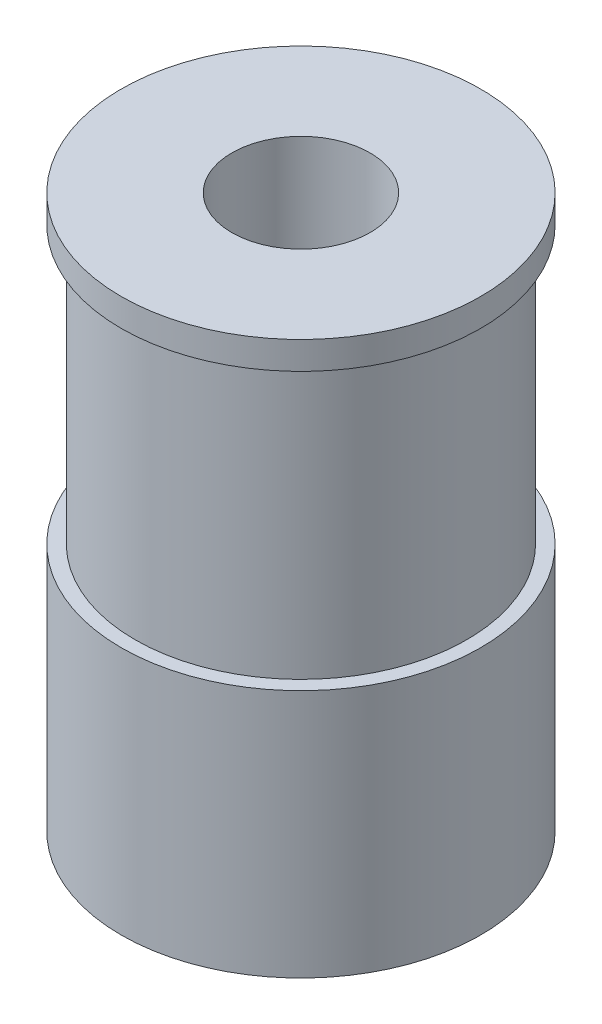
ISO-10303-21;
HEADER;
FILE_DESCRIPTION(('STEP AP214'),'2;1');
FILE_NAME('part.step','',(''),(''),'','','');
FILE_SCHEMA(('AUTOMOTIVE_DESIGN { 1 0 10303 214 1 1 1 1 }'));
ENDSEC;
DATA;
#1=APPLICATION_CONTEXT('core data for automotive mechanical design processes');
#2=APPLICATION_PROTOCOL_DEFINITION('international standard','automotive_design',2000,#1);
#3=PRODUCT_CONTEXT('',#1,'mechanical');
#4=PRODUCT('Part','Part','',(#3));
#5=PRODUCT_RELATED_PRODUCT_CATEGORY('part','',(#4));
#6=PRODUCT_DEFINITION_FORMATION('','',#4);
#7=PRODUCT_DEFINITION_CONTEXT('part definition',#1,'design');
#8=PRODUCT_DEFINITION('design','',#6,#7);
#9=PRODUCT_DEFINITION_SHAPE('','',#8);
#10=(LENGTH_UNIT() NAMED_UNIT(*) SI_UNIT(.MILLI.,.METRE.));
#11=(NAMED_UNIT(*) PLANE_ANGLE_UNIT() SI_UNIT($,.RADIAN.));
#12=(NAMED_UNIT(*) SI_UNIT($,.STERADIAN.) SOLID_ANGLE_UNIT());
#13=UNCERTAINTY_MEASURE_WITH_UNIT(LENGTH_MEASURE(1.E-05),#10,'distance_accuracy_value','');
#14=(GEOMETRIC_REPRESENTATION_CONTEXT(3) GLOBAL_UNCERTAINTY_ASSIGNED_CONTEXT((#13)) GLOBAL_UNIT_ASSIGNED_CONTEXT((#10,
#11,#12)) REPRESENTATION_CONTEXT('',''));
#15=CARTESIAN_POINT('',(0.,0.,0.));
#16=DIRECTION('',(0.,0.,1.));
#17=DIRECTION('',(1.,0.,0.));
#18=AXIS2_PLACEMENT_3D('',#15,#16,#17);
#19=CARTESIAN_POINT('',(0.,20.,0.));
#20=DIRECTION('',(0.,-1.,0.));
#21=DIRECTION('',(0.,0.,-1.));
#22=AXIS2_PLACEMENT_3D('',#19,#20,#21);
#23=CYLINDRICAL_SURFACE('',#22,6.5);
#24=CARTESIAN_POINT('',(0.,0.,0.));
#25=DIRECTION('',(0.,1.,0.));
#26=DIRECTION('',(0.,0.,1.));
#27=AXIS2_PLACEMENT_3D('',#24,#25,#26);
#28=CIRCLE('',#27,6.5);
#29=CARTESIAN_POINT('',(0.,0.,6.5));
#30=VERTEX_POINT('',#29);
#31=EDGE_CURVE('E41',#30,#30,#28,.T.);
#32=ORIENTED_EDGE('',*,*,#31,.T.);
#33=EDGE_LOOP('',(#32));
#34=FACE_BOUND('',#33,.T.);
#35=CARTESIAN_POINT('',(0.,9.,0.));
#36=DIRECTION('',(0.,1.,0.));
#37=DIRECTION('',(0.,0.,1.));
#38=AXIS2_PLACEMENT_3D('',#35,#36,#37);
#39=CIRCLE('',#38,6.5);
#40=CARTESIAN_POINT('',(0.,9.,6.5));
#41=VERTEX_POINT('',#40);
#42=EDGE_CURVE('E37',#41,#41,#39,.T.);
#43=ORIENTED_EDGE('',*,*,#42,.F.);
#44=EDGE_LOOP('',(#43));
#45=FACE_BOUND('',#44,.T.);
#46=ADVANCED_FACE('F33',(#34,#45),#23,.T.);
#47=CARTESIAN_POINT('',(0.,20.,0.));
#48=DIRECTION('',(0.,1.,0.));
#49=DIRECTION('',(0.,0.,1.));
#50=AXIS2_PLACEMENT_3D('',#47,#48,#49);
#51=PLANE('',#50);
#52=CARTESIAN_POINT('',(0.,20.,0.));
#53=DIRECTION('',(0.,1.,0.));
#54=DIRECTION('',(0.,0.,1.));
#55=AXIS2_PLACEMENT_3D('',#52,#53,#54);
#56=CIRCLE('',#55,6.5);
#57=CARTESIAN_POINT('',(0.,20.,6.5));
#58=VERTEX_POINT('',#57);
#59=EDGE_CURVE('E10',#58,#58,#56,.T.);
#60=ORIENTED_EDGE('',*,*,#59,.T.);
#61=EDGE_LOOP('',(#60));
#62=FACE_BOUND('',#61,.T.);
#63=CARTESIAN_POINT('',(0.,20.,0.));
#64=DIRECTION('',(0.,1.,0.));
#65=DIRECTION('',(0.,0.,1.));
#66=AXIS2_PLACEMENT_3D('',#63,#64,#65);
#67=CIRCLE('',#66,2.5);
#68=CARTESIAN_POINT('',(0.,20.,2.5));
#69=VERTEX_POINT('',#68);
#70=EDGE_CURVE('E46',#69,#69,#67,.T.);
#71=ORIENTED_EDGE('',*,*,#70,.F.);
#72=EDGE_LOOP('',(#71));
#73=FACE_BOUND('',#72,.T.);
#74=ADVANCED_FACE('F86',(#62,#73),#51,.T.);
#75=CARTESIAN_POINT('',(0.,0.,0.));
#76=DIRECTION('',(0.,1.,0.));
#77=DIRECTION('',(0.,0.,1.));
#78=AXIS2_PLACEMENT_3D('',#75,#76,#77);
#79=PLANE('',#78);
#80=ORIENTED_EDGE('',*,*,#31,.F.);
#81=EDGE_LOOP('',(#80));
#82=FACE_BOUND('',#81,.T.);
#83=CARTESIAN_POINT('',(0.,0.,0.));
#84=DIRECTION('',(0.,1.,0.));
#85=DIRECTION('',(0.,0.,1.));
#86=AXIS2_PLACEMENT_3D('',#83,#84,#85);
#87=CIRCLE('',#86,2.5);
#88=CARTESIAN_POINT('',(0.,0.,2.5));
#89=VERTEX_POINT('',#88);
#90=EDGE_CURVE('E49',#89,#89,#87,.T.);
#91=ORIENTED_EDGE('',*,*,#90,.T.);
#92=EDGE_LOOP('',(#91));
#93=FACE_BOUND('',#92,.T.);
#94=ADVANCED_FACE('F70',(#82,#93),#79,.F.);
#95=CARTESIAN_POINT('',(0.,19.,0.));
#96=DIRECTION('',(0.,1.,0.));
#97=DIRECTION('',(0.,0.,1.));
#98=AXIS2_PLACEMENT_3D('',#95,#96,#97);
#99=CIRCLE('',#98,6.5);
#100=CARTESIAN_POINT('',(0.,19.,6.5));
#101=VERTEX_POINT('',#100);
#102=EDGE_CURVE('E51',#101,#101,#99,.T.);
#103=ORIENTED_EDGE('',*,*,#102,.T.);
#104=EDGE_LOOP('',(#103));
#105=FACE_BOUND('',#104,.T.);
#106=ORIENTED_EDGE('',*,*,#59,.F.);
#107=EDGE_LOOP('',(#106));
#108=FACE_BOUND('',#107,.T.);
#109=ADVANCED_FACE('F35',(#105,#108),#23,.T.);
#110=CARTESIAN_POINT('',(0.,20.,0.));
#111=DIRECTION('',(0.,-1.,0.));
#112=DIRECTION('',(0.,0.,-1.));
#113=AXIS2_PLACEMENT_3D('',#110,#111,#112);
#114=CYLINDRICAL_SURFACE('',#113,2.5);
#115=ORIENTED_EDGE('',*,*,#70,.T.);
#116=EDGE_LOOP('',(#115));
#117=FACE_BOUND('',#116,.T.);
#118=ORIENTED_EDGE('',*,*,#90,.F.);
#119=EDGE_LOOP('',(#118));
#120=FACE_BOUND('',#119,.T.);
#121=ADVANCED_FACE('F72',(#117,#120),#114,.F.);
#122=CARTESIAN_POINT('',(0.,9.,0.));
#123=DIRECTION('',(0.,1.,0.));
#124=DIRECTION('',(0.,0.,1.));
#125=AXIS2_PLACEMENT_3D('',#122,#123,#124);
#126=PLANE('',#125);
#127=CARTESIAN_POINT('',(0.,9.,0.));
#128=DIRECTION('',(0.,1.,0.));
#129=DIRECTION('',(0.,0.,1.));
#130=AXIS2_PLACEMENT_3D('',#127,#128,#129);
#131=CIRCLE('',#130,6.);
#132=CARTESIAN_POINT('',(0.,9.,6.));
#133=VERTEX_POINT('',#132);
#134=EDGE_CURVE('E53',#133,#133,#131,.T.);
#135=ORIENTED_EDGE('',*,*,#134,.F.);
#136=EDGE_LOOP('',(#135));
#137=FACE_BOUND('',#136,.T.);
#138=ORIENTED_EDGE('',*,*,#42,.T.);
#139=EDGE_LOOP('',(#138));
#140=FACE_BOUND('',#139,.T.);
#141=ADVANCED_FACE('F74',(#137,#140),#126,.T.);
#142=CARTESIAN_POINT('',(0.,19.,0.));
#143=DIRECTION('',(0.,1.,0.));
#144=DIRECTION('',(0.,0.,1.));
#145=AXIS2_PLACEMENT_3D('',#142,#143,#144);
#146=PLANE('',#145);
#147=CARTESIAN_POINT('',(0.,19.,0.));
#148=DIRECTION('',(0.,1.,0.));
#149=DIRECTION('',(0.,0.,1.));
#150=AXIS2_PLACEMENT_3D('',#147,#148,#149);
#151=CIRCLE('',#150,6.);
#152=CARTESIAN_POINT('',(0.,19.,6.));
#153=VERTEX_POINT('',#152);
#154=EDGE_CURVE('E58',#153,#153,#151,.T.);
#155=ORIENTED_EDGE('',*,*,#154,.T.);
#156=EDGE_LOOP('',(#155));
#157=FACE_BOUND('',#156,.T.);
#158=ORIENTED_EDGE('',*,*,#102,.F.);
#159=EDGE_LOOP('',(#158));
#160=FACE_BOUND('',#159,.T.);
#161=ADVANCED_FACE('F80',(#157,#160),#146,.F.);
#162=CARTESIAN_POINT('',(0.,9.,0.));
#163=DIRECTION('',(0.,1.,0.));
#164=DIRECTION('',(0.,0.,1.));
#165=AXIS2_PLACEMENT_3D('',#162,#163,#164);
#166=CYLINDRICAL_SURFACE('',#165,6.);
#167=ORIENTED_EDGE('',*,*,#134,.T.);
#168=EDGE_LOOP('',(#167));
#169=FACE_BOUND('',#168,.T.);
#170=ORIENTED_EDGE('',*,*,#154,.F.);
#171=EDGE_LOOP('',(#170));
#172=FACE_BOUND('',#171,.T.);
#173=ADVANCED_FACE('F123',(#169,#172),#166,.T.);
#174=CLOSED_SHELL('',(#46,#74,#94,#109,#121,#141,#161,#173));
#175=MANIFOLD_SOLID_BREP('B2',#174);
#176=ADVANCED_BREP_SHAPE_REPRESENTATION('',(#18,#175),#14);
#177=SHAPE_DEFINITION_REPRESENTATION(#9,#176);
ENDSEC;
END-ISO-10303-21;
